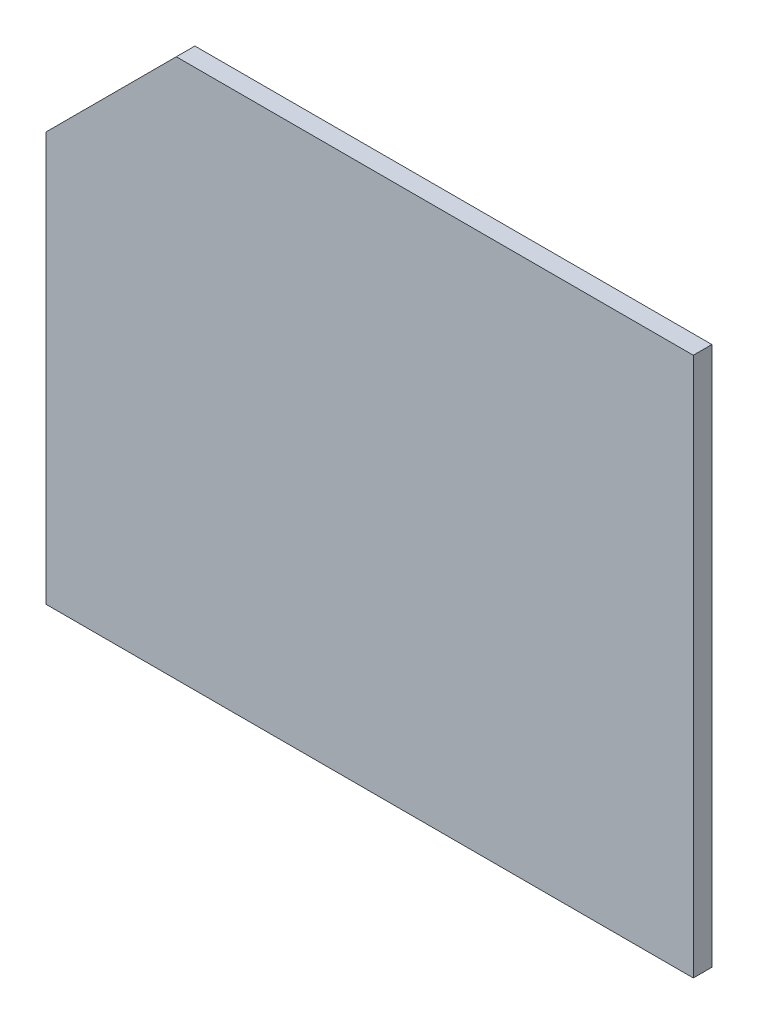
ISO-10303-21;
HEADER;
FILE_DESCRIPTION(('STEP AP214'),'2;1');
FILE_NAME('part.step','',(''),(''),'','','');
FILE_SCHEMA(('AUTOMOTIVE_DESIGN { 1 0 10303 214 1 1 1 1 }'));
ENDSEC;
DATA;
#1=APPLICATION_CONTEXT('core data for automotive mechanical design processes');
#2=APPLICATION_PROTOCOL_DEFINITION('international standard','automotive_design',2000,#1);
#3=PRODUCT_CONTEXT('',#1,'mechanical');
#4=PRODUCT('Part','Part','',(#3));
#5=PRODUCT_RELATED_PRODUCT_CATEGORY('part','',(#4));
#6=PRODUCT_DEFINITION_FORMATION('','',#4);
#7=PRODUCT_DEFINITION_CONTEXT('part definition',#1,'design');
#8=PRODUCT_DEFINITION('design','',#6,#7);
#9=PRODUCT_DEFINITION_SHAPE('','',#8);
#10=(LENGTH_UNIT() NAMED_UNIT(*) SI_UNIT(.MILLI.,.METRE.));
#11=(NAMED_UNIT(*) PLANE_ANGLE_UNIT() SI_UNIT($,.RADIAN.));
#12=(NAMED_UNIT(*) SI_UNIT($,.STERADIAN.) SOLID_ANGLE_UNIT());
#13=UNCERTAINTY_MEASURE_WITH_UNIT(LENGTH_MEASURE(1.E-05),#10,'distance_accuracy_value','');
#14=(GEOMETRIC_REPRESENTATION_CONTEXT(3) GLOBAL_UNCERTAINTY_ASSIGNED_CONTEXT((#13)) GLOBAL_UNIT_ASSIGNED_CONTEXT((#10,
#11,#12)) REPRESENTATION_CONTEXT('',''));
#15=CARTESIAN_POINT('',(0.,0.,0.));
#16=DIRECTION('',(0.,0.,1.));
#17=DIRECTION('',(1.,0.,0.));
#18=AXIS2_PLACEMENT_3D('',#15,#16,#17);
#19=CARTESIAN_POINT('',(-16.0071982312313,18.4609707111164,-0.0549990393167716));
#20=CARTESIAN_POINT('',(-16.0071982312313,18.460970705871,0.00500096068322811));
#21=CARTESIAN_POINT('',(-16.0071981551734,20.2009707111165,-0.0549988872012145));
#22=CARTESIAN_POINT('',(-16.0071981551734,20.2009707058711,0.00500111279878516));
#23=(BOUNDED_SURFACE() B_SPLINE_SURFACE(1,1,((#19,#20),(#21,#22)),.UNSPECIFIED.,.F.,.F.,
.F.) B_SPLINE_SURFACE_WITH_KNOTS((2,2),(2,2),(-0.000145000000000004,0.00159500000000005),
(-5.5E-05,5.E-06),.UNSPECIFIED.) GEOMETRIC_REPRESENTATION_ITEM() RATIONAL_B_SPLINE_SURFACE(((1.,
1.),(1.,1.))) REPRESENTATION_ITEM('') SURFACE());
#24=CARTESIAN_POINT('',(-16.0071981615116,20.0559707063082,1.10012248876606E-06));
#25=CARTESIAN_POINT('',(-16.0071982248931,18.6059707063082,9.73359524551742E-07));
#26=(BOUNDED_CURVE() B_SPLINE_CURVE(1,(#24,#25),.UNSPECIFIED.,.F.,
.F.) B_SPLINE_CURVE_WITH_KNOTS((2,2),(0.,0.00145),
.UNSPECIFIED.) CURVE() GEOMETRIC_REPRESENTATION_ITEM() RATIONAL_B_SPLINE_CURVE((1.,1.)) REPRESENTATION_ITEM(''));
#27=CARTESIAN_POINT('',(-16.0071981615116,20.0559707063082,1.10012248876606E-06));
#28=VERTEX_POINT('',#27);
#29=CARTESIAN_POINT('',(-16.0071982248931,18.6059707063082,9.73359524491374E-07));
#30=VERTEX_POINT('',#29);
#31=EDGE_CURVE('E74',#28,#30,#26,.T.);
#32=CARTESIAN_POINT('',(-16.0071982248931,18.6059707063082,9.73359524491374E-07));
#33=CARTESIAN_POINT('',(-16.0071982248931,18.6059707106793,-0.0499990266404752));
#34=(BOUNDED_CURVE() B_SPLINE_CURVE(1,(#32,#33),.UNSPECIFIED.,.F.,
.F.) B_SPLINE_CURVE_WITH_KNOTS((2,2),(0.,5.E-05),
.UNSPECIFIED.) CURVE() GEOMETRIC_REPRESENTATION_ITEM() RATIONAL_B_SPLINE_CURVE((1.,1.)) REPRESENTATION_ITEM(''));
#35=CARTESIAN_POINT('',(-16.0071982248931,18.6059707106793,-0.0499990266404752));
#36=VERTEX_POINT('',#35);
#37=EDGE_CURVE('E11',#30,#36,#34,.T.);
#38=CARTESIAN_POINT('',(-16.0071981615116,20.0559707106793,-0.0499988998775109));
#39=CARTESIAN_POINT('',(-16.0071982248931,18.6059707106793,-0.0499990266404751));
#40=(BOUNDED_CURVE() B_SPLINE_CURVE(1,(#38,#39),.UNSPECIFIED.,.F.,
.F.) B_SPLINE_CURVE_WITH_KNOTS((2,2),(0.,0.00145),
.UNSPECIFIED.) CURVE() GEOMETRIC_REPRESENTATION_ITEM() RATIONAL_B_SPLINE_CURVE((1.,1.)) REPRESENTATION_ITEM(''));
#41=CARTESIAN_POINT('',(-16.0071981615116,20.0559707106793,-0.0499988998775109));
#42=VERTEX_POINT('',#41);
#43=EDGE_CURVE('E79',#42,#36,#40,.T.);
#44=CARTESIAN_POINT('',(-16.0071981615116,20.0559707063082,1.10012248876606E-06));
#45=CARTESIAN_POINT('',(-16.0071981615116,20.0559707106793,-0.0499988998775109));
#46=(BOUNDED_CURVE() B_SPLINE_CURVE(1,(#44,#45),.UNSPECIFIED.,.F.,
.F.) B_SPLINE_CURVE_WITH_KNOTS((2,2),(0.,5.E-05),
.UNSPECIFIED.) CURVE() GEOMETRIC_REPRESENTATION_ITEM() RATIONAL_B_SPLINE_CURVE((1.,1.)) REPRESENTATION_ITEM(''));
#47=EDGE_CURVE('E62',#28,#42,#46,.T.);
#48=ORIENTED_EDGE('',*,*,#31,.T.);
#49=ORIENTED_EDGE('',*,*,#37,.T.);
#50=ORIENTED_EDGE('',*,*,#43,.F.);
#51=ORIENTED_EDGE('',*,*,#47,.F.);
#52=EDGE_LOOP('',(#48,#49,#50,#51));
#53=FACE_BOUND('',#52,.T.);
#54=ADVANCED_FACE('F17',(#53),#23,.T.);
#55=CARTESIAN_POINT('',(-17.9211982248931,18.60597079478,-0.054999026640468));
#56=CARTESIAN_POINT('',(-17.9211982248931,18.6059707895347,0.00500097335953179));
#57=CARTESIAN_POINT('',(-15.8331982248931,18.6059707035107,-0.054999026640476));
#58=CARTESIAN_POINT('',(-15.8331982248931,18.6059706982653,0.00500097335952381));
#59=(BOUNDED_SURFACE() B_SPLINE_SURFACE(1,1,((#55,#56),(#57,#58)),.UNSPECIFIED.,.F.,.F.,
.F.) B_SPLINE_SURFACE_WITH_KNOTS((2,2),(2,2),(-0.000174,0.001914),(-5.5E-05,5.E-06),
.UNSPECIFIED.) GEOMETRIC_REPRESENTATION_ITEM() RATIONAL_B_SPLINE_SURFACE(((1.,1.),(1.,1.))) REPRESENTATION_ITEM('') SURFACE());
#60=CARTESIAN_POINT('',(-16.0071982248931,18.6059707063082,9.73359524491374E-07));
#61=CARTESIAN_POINT('',(-17.7471982248931,18.605970782366,9.73359531140556E-07));
#62=(BOUNDED_CURVE() B_SPLINE_CURVE(1,(#60,#61),.UNSPECIFIED.,.F.,
.F.) B_SPLINE_CURVE_WITH_KNOTS((2,2),(0.,0.00174),
.UNSPECIFIED.) CURVE() GEOMETRIC_REPRESENTATION_ITEM() RATIONAL_B_SPLINE_CURVE((1.,1.)) REPRESENTATION_ITEM(''));
#63=CARTESIAN_POINT('',(-17.7471982248931,18.605970782366,9.73359530996587E-07));
#64=VERTEX_POINT('',#63);
#65=EDGE_CURVE('E137',#30,#64,#62,.T.);
#66=CARTESIAN_POINT('',(-17.7471982248931,18.605970782366,9.73359530996587E-07));
#67=CARTESIAN_POINT('',(-17.7471982248931,18.6059707867371,-0.0499990266404687));
#68=(BOUNDED_CURVE() B_SPLINE_CURVE(1,(#66,#67),.UNSPECIFIED.,.F.,
.F.) B_SPLINE_CURVE_WITH_KNOTS((2,2),(0.,5.E-05),
.UNSPECIFIED.) CURVE() GEOMETRIC_REPRESENTATION_ITEM() RATIONAL_B_SPLINE_CURVE((1.,1.)) REPRESENTATION_ITEM(''));
#69=CARTESIAN_POINT('',(-17.7471982248931,18.6059707867372,-0.0499990266404687));
#70=VERTEX_POINT('',#69);
#71=EDGE_CURVE('E32',#64,#70,#68,.T.);
#72=CARTESIAN_POINT('',(-16.0071982248931,18.6059707106793,-0.0499990266404752));
#73=CARTESIAN_POINT('',(-17.7471982248931,18.6059707867371,-0.0499990266404685));
#74=(BOUNDED_CURVE() B_SPLINE_CURVE(1,(#72,#73),.UNSPECIFIED.,.F.,
.F.) B_SPLINE_CURVE_WITH_KNOTS((2,2),(0.,0.00174),
.UNSPECIFIED.) CURVE() GEOMETRIC_REPRESENTATION_ITEM() RATIONAL_B_SPLINE_CURVE((1.,1.)) REPRESENTATION_ITEM(''));
#75=EDGE_CURVE('E86',#36,#70,#74,.T.);
#76=ORIENTED_EDGE('',*,*,#65,.T.);
#77=ORIENTED_EDGE('',*,*,#71,.T.);
#78=ORIENTED_EDGE('',*,*,#75,.F.);
#79=ORIENTED_EDGE('',*,*,#37,.F.);
#80=EDGE_LOOP('',(#76,#77,#78,#79));
#81=FACE_BOUND('',#80,.T.);
#82=ADVANCED_FACE('F286',(#81),#59,.T.);
#83=CARTESIAN_POINT('',(-17.7471981720023,19.8159707871743,-0.0549989208589606));
#84=CARTESIAN_POINT('',(-17.7471981720023,19.8159707819289,0.00500107914103908));
#85=CARTESIAN_POINT('',(-17.7471982297014,18.4959707871743,-0.0549990362569694));
#86=CARTESIAN_POINT('',(-17.7471982297014,18.4959707819289,0.00500096374303028));
#87=(BOUNDED_SURFACE() B_SPLINE_SURFACE(1,1,((#83,#84),(#85,#86)),.UNSPECIFIED.,.F.,.F.,
.F.) B_SPLINE_SURFACE_WITH_KNOTS((2,2),(2,2),(-0.000110000000000002,0.00121),(-5.5E-05,5.E-06),
.UNSPECIFIED.) GEOMETRIC_REPRESENTATION_ITEM() RATIONAL_B_SPLINE_SURFACE(((1.,1.),(1.,1.))) REPRESENTATION_ITEM('') SURFACE());
#88=CARTESIAN_POINT('',(-17.7471982248931,18.605970782366,9.73359530996587E-07));
#89=CARTESIAN_POINT('',(-17.7471981768106,19.705970782366,1.06952453833159E-06));
#90=(BOUNDED_CURVE() B_SPLINE_CURVE(1,(#88,#89),.UNSPECIFIED.,.F.,
.F.) B_SPLINE_CURVE_WITH_KNOTS((2,2),(0.,0.0011),
.UNSPECIFIED.) CURVE() GEOMETRIC_REPRESENTATION_ITEM() RATIONAL_B_SPLINE_CURVE((1.,1.)) REPRESENTATION_ITEM(''));
#91=CARTESIAN_POINT('',(-17.7471981768105,19.705970782366,1.06952453837739E-06));
#92=VERTEX_POINT('',#91);
#93=EDGE_CURVE('E97',#64,#92,#90,.T.);
#94=CARTESIAN_POINT('',(-17.7471981768105,19.705970782366,1.06952453837739E-06));
#95=CARTESIAN_POINT('',(-17.7471981768105,19.7059707867371,-0.0499989304754613));
#96=(BOUNDED_CURVE() B_SPLINE_CURVE(1,(#94,#95),.UNSPECIFIED.,.F.,
.F.) B_SPLINE_CURVE_WITH_KNOTS((2,2),(0.,5.E-05),
.UNSPECIFIED.) CURVE() GEOMETRIC_REPRESENTATION_ITEM() RATIONAL_B_SPLINE_CURVE((1.,1.)) REPRESENTATION_ITEM(''));
#97=CARTESIAN_POINT('',(-17.7471981768105,19.7059707867371,-0.0499989304754613));
#98=VERTEX_POINT('',#97);
#99=EDGE_CURVE('E23',#92,#98,#96,.T.);
#100=CARTESIAN_POINT('',(-17.7471982248931,18.6059707867372,-0.0499990266404687));
#101=CARTESIAN_POINT('',(-17.7471981768106,19.7059707867371,-0.0499989304754614));
#102=(BOUNDED_CURVE() B_SPLINE_CURVE(1,(#100,#101),.UNSPECIFIED.,.F.,
.F.) B_SPLINE_CURVE_WITH_KNOTS((2,2),(0.,0.0010999999999999),
.UNSPECIFIED.) CURVE() GEOMETRIC_REPRESENTATION_ITEM() RATIONAL_B_SPLINE_CURVE((1.,1.)) REPRESENTATION_ITEM(''));
#103=EDGE_CURVE('E92',#70,#98,#102,.T.);
#104=ORIENTED_EDGE('',*,*,#93,.T.);
#105=ORIENTED_EDGE('',*,*,#99,.T.);
#106=ORIENTED_EDGE('',*,*,#103,.F.);
#107=ORIENTED_EDGE('',*,*,#71,.F.);
#108=EDGE_LOOP('',(#104,#105,#106,#107));
#109=FACE_BOUND('',#108,.T.);
#110=ADVANCED_FACE('F185',(#109),#87,.T.);
#111=CARTESIAN_POINT('',(-17.3621981599816,20.0909707703454,-0.0549988968177102));
#112=CARTESIAN_POINT('',(-17.3621981599816,20.0909707651,0.0050011031822895));
#113=CARTESIAN_POINT('',(-17.7821981783404,19.6709707887041,-0.0549989335352568));
#114=CARTESIAN_POINT('',(-17.7821981783404,19.6709707834588,0.00500106646474285));
#115=(BOUNDED_SURFACE() B_SPLINE_SURFACE(1,1,((#111,#112),(#113,#114)),.UNSPECIFIED.,.F.,.F.,
.F.) B_SPLINE_SURFACE_WITH_KNOTS((2,2),(2,2),(-4.94974746830934E-05,0.000544472221513689),
(-5.5E-05,5.E-06),.UNSPECIFIED.) GEOMETRIC_REPRESENTATION_ITEM() RATIONAL_B_SPLINE_SURFACE(((1.,
1.),(1.,1.))) REPRESENTATION_ITEM('') SURFACE());
#116=CARTESIAN_POINT('',(-17.7471981768105,19.705970782366,1.06952453837739E-06));
#117=CARTESIAN_POINT('',(-17.3971981615115,20.055970767067,1.10012249391923E-06));
#118=(BOUNDED_CURVE() B_SPLINE_CURVE(1,(#116,#117),.UNSPECIFIED.,.F.,
.F.) B_SPLINE_CURVE_WITH_KNOTS((2,2),(0.,0.00049497474683058),
.UNSPECIFIED.) CURVE() GEOMETRIC_REPRESENTATION_ITEM() RATIONAL_B_SPLINE_CURVE((1.,1.)) REPRESENTATION_ITEM(''));
#119=CARTESIAN_POINT('',(-17.3971981615115,20.055970767067,1.10012249397023E-06));
#120=VERTEX_POINT('',#119);
#121=EDGE_CURVE('E153',#92,#120,#118,.T.);
#122=CARTESIAN_POINT('',(-17.3971981615115,20.055970767067,1.10012249397023E-06));
#123=CARTESIAN_POINT('',(-17.3971981615115,20.0559707714381,-0.0499988998775057));
#124=(BOUNDED_CURVE() B_SPLINE_CURVE(1,(#122,#123),.UNSPECIFIED.,.F.,
.F.) B_SPLINE_CURVE_WITH_KNOTS((2,2),(0.,5.E-05),
.UNSPECIFIED.) CURVE() GEOMETRIC_REPRESENTATION_ITEM() RATIONAL_B_SPLINE_CURVE((1.,1.)) REPRESENTATION_ITEM(''));
#125=CARTESIAN_POINT('',(-17.3971981615115,20.0559707714382,-0.0499988998775057));
#126=VERTEX_POINT('',#125);
#127=EDGE_CURVE('E73',#120,#126,#124,.T.);
#128=CARTESIAN_POINT('',(-17.7471981768105,19.7059707867371,-0.0499989304754613));
#129=CARTESIAN_POINT('',(-17.3971981615115,20.0559707714382,-0.0499988998775058));
#130=(BOUNDED_CURVE() B_SPLINE_CURVE(1,(#128,#129),.UNSPECIFIED.,.F.,
.F.) B_SPLINE_CURVE_WITH_KNOTS((2,2),(0.,0.000494974746830654),
.UNSPECIFIED.) CURVE() GEOMETRIC_REPRESENTATION_ITEM() RATIONAL_B_SPLINE_CURVE((1.,1.)) REPRESENTATION_ITEM(''));
#131=EDGE_CURVE('E82',#98,#126,#130,.T.);
#132=ORIENTED_EDGE('',*,*,#121,.T.);
#133=ORIENTED_EDGE('',*,*,#127,.T.);
#134=ORIENTED_EDGE('',*,*,#131,.F.);
#135=ORIENTED_EDGE('',*,*,#99,.F.);
#136=EDGE_LOOP('',(#132,#133,#134,#135));
#137=FACE_BOUND('',#136,.T.);
#138=ADVANCED_FACE('F189',(#137),#115,.T.);
#139=CARTESIAN_POINT('',(-15.8681981615116,20.0559707050405,-0.0549988998775115));
#140=CARTESIAN_POINT('',(-15.8681981615116,20.0559706997952,0.00500110012248822));
#141=CARTESIAN_POINT('',(-17.5361981615115,20.0559707779511,-0.0549988998775051));
#142=CARTESIAN_POINT('',(-17.5361981615115,20.0559707727058,0.00500110012249459));
#143=(BOUNDED_SURFACE() B_SPLINE_SURFACE(1,1,((#139,#140),(#141,#142)),.UNSPECIFIED.,.F.,.F.,
.F.) B_SPLINE_SURFACE_WITH_KNOTS((2,2),(2,2),(-0.00013899999999999,0.00152899999999989),
(-5.5E-05,5.0000000000001E-06),
.UNSPECIFIED.) GEOMETRIC_REPRESENTATION_ITEM() RATIONAL_B_SPLINE_SURFACE(((1.,1.),(1.,1.))) REPRESENTATION_ITEM('') SURFACE());
#144=CARTESIAN_POINT('',(-17.3971981615115,20.055970767067,1.10012249397023E-06));
#145=CARTESIAN_POINT('',(-16.0071981615116,20.0559707063082,1.10012248865853E-06));
#146=(BOUNDED_CURVE() B_SPLINE_CURVE(1,(#144,#145),.UNSPECIFIED.,.F.,
.F.) B_SPLINE_CURVE_WITH_KNOTS((2,2),(0.,0.0013899999999999),
.UNSPECIFIED.) CURVE() GEOMETRIC_REPRESENTATION_ITEM() RATIONAL_B_SPLINE_CURVE((1.,1.)) REPRESENTATION_ITEM(''));
#147=EDGE_CURVE('E68',#120,#28,#146,.T.);
#148=CARTESIAN_POINT('',(-17.3971981615115,20.0559707714382,-0.0499988998775057));
#149=CARTESIAN_POINT('',(-16.0071981615116,20.0559707106794,-0.049998899877511));
#150=(BOUNDED_CURVE() B_SPLINE_CURVE(1,(#148,#149),.UNSPECIFIED.,.F.,
.F.) B_SPLINE_CURVE_WITH_KNOTS((2,2),(0.,0.0013899999999999),
.UNSPECIFIED.) CURVE() GEOMETRIC_REPRESENTATION_ITEM() RATIONAL_B_SPLINE_CURVE((1.,1.)) REPRESENTATION_ITEM(''));
#151=EDGE_CURVE('E65',#126,#42,#150,.T.);
#152=ORIENTED_EDGE('',*,*,#147,.T.);
#153=ORIENTED_EDGE('',*,*,#47,.T.);
#154=ORIENTED_EDGE('',*,*,#151,.F.);
#155=ORIENTED_EDGE('',*,*,#127,.F.);
#156=EDGE_LOOP('',(#152,#153,#154,#155));
#157=FACE_BOUND('',#156,.T.);
#158=ADVANCED_FACE('F19',(#157),#143,.T.);
#159=CARTESIAN_POINT('',(-15.8331982312312,18.4609706987024,9.6068322746539E-07));
#160=CARTESIAN_POINT('',(-17.9211982312313,18.4609707899718,9.60683235444409E-07));
#161=CARTESIAN_POINT('',(-15.8331981551734,20.2009706987024,1.11279878452257E-06));
#162=CARTESIAN_POINT('',(-17.9211981551734,20.2009707899718,1.11279879250159E-06));
#163=(BOUNDED_SURFACE() B_SPLINE_SURFACE(1,1,((#159,#160),(#161,#162)),.UNSPECIFIED.,.F.,.F.,
.F.) B_SPLINE_SURFACE_WITH_KNOTS((2,2),(2,2),(-0.001595,0.000145000000000002),
(-0.000174000000000014,0.001914),
.UNSPECIFIED.) GEOMETRIC_REPRESENTATION_ITEM() RATIONAL_B_SPLINE_SURFACE(((1.,1.),(1.,1.))) REPRESENTATION_ITEM('') SURFACE());
#164=ORIENTED_EDGE('',*,*,#147,.F.);
#165=ORIENTED_EDGE('',*,*,#121,.F.);
#166=ORIENTED_EDGE('',*,*,#93,.F.);
#167=ORIENTED_EDGE('',*,*,#65,.F.);
#168=ORIENTED_EDGE('',*,*,#31,.F.);
#169=EDGE_LOOP('',(#164,#165,#166,#167,#168));
#170=FACE_BOUND('',#169,.T.);
#171=ADVANCED_FACE('F187',(#170),#163,.T.);
#172=CARTESIAN_POINT('',(-15.8331981551734,20.2009707030736,-0.0499988872012151));
#173=CARTESIAN_POINT('',(-17.9211981551734,20.200970794343,-0.0499988872012072));
#174=CARTESIAN_POINT('',(-15.8331982312312,18.4609707030735,-0.0499990393167722));
#175=CARTESIAN_POINT('',(-17.9211982312313,18.4609707943429,-0.0499990393167642));
#176=(BOUNDED_SURFACE() B_SPLINE_SURFACE(1,1,((#172,#173),(#174,#175)),.UNSPECIFIED.,.F.,.F.,
.F.) B_SPLINE_SURFACE_WITH_KNOTS((2,2),(2,2),(-0.001595,0.000145000000000079),
(-0.000174000000000014,0.001914),
.UNSPECIFIED.) GEOMETRIC_REPRESENTATION_ITEM() RATIONAL_B_SPLINE_SURFACE(((1.,1.),(1.,1.))) REPRESENTATION_ITEM('') SURFACE());
#177=ORIENTED_EDGE('',*,*,#43,.T.);
#178=ORIENTED_EDGE('',*,*,#75,.T.);
#179=ORIENTED_EDGE('',*,*,#103,.T.);
#180=ORIENTED_EDGE('',*,*,#131,.T.);
#181=ORIENTED_EDGE('',*,*,#151,.T.);
#182=EDGE_LOOP('',(#177,#178,#179,#180,#181));
#183=FACE_BOUND('',#182,.T.);
#184=ADVANCED_FACE('F77',(#183),#176,.T.);
#185=CLOSED_SHELL('',(#54,#82,#110,#138,#158,#171,#184));
#186=MANIFOLD_SOLID_BREP('B1',#185);
#187=ADVANCED_BREP_SHAPE_REPRESENTATION('',(#18,#186),#14);
#188=SHAPE_DEFINITION_REPRESENTATION(#9,#187);
ENDSEC;
END-ISO-10303-21;
